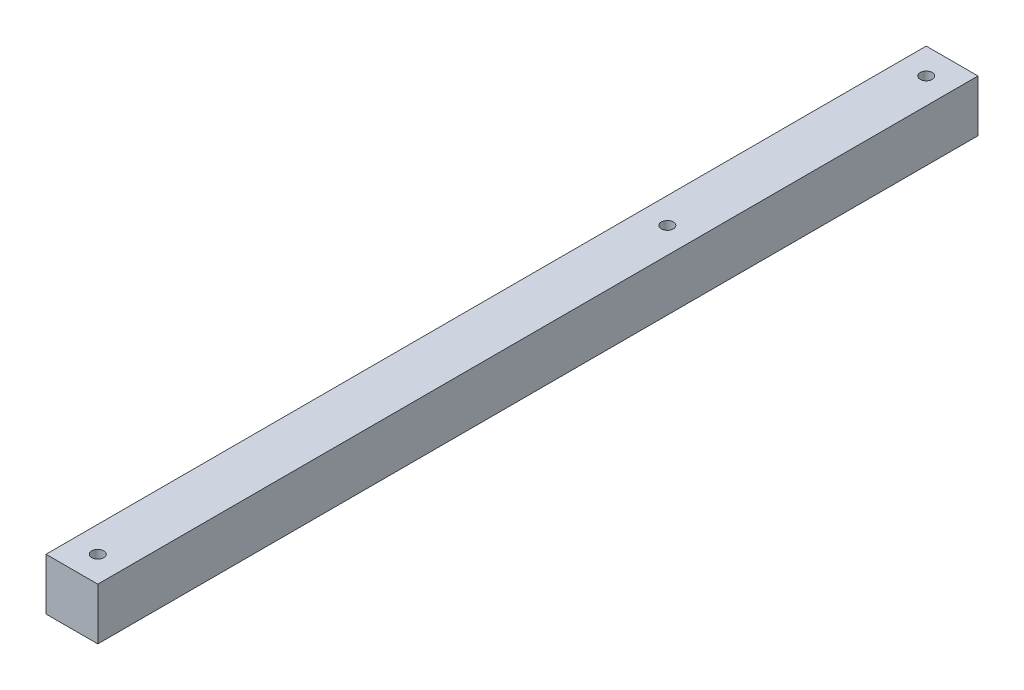
ISO-10303-21;
HEADER;
FILE_DESCRIPTION(('STEP AP214'),'2;1');
FILE_NAME('part.step','',(''),(''),'','','');
FILE_SCHEMA(('AUTOMOTIVE_DESIGN { 1 0 10303 214 1 1 1 1 }'));
ENDSEC;
DATA;
#1=APPLICATION_CONTEXT('core data for automotive mechanical design processes');
#2=APPLICATION_PROTOCOL_DEFINITION('international standard','automotive_design',2000,#1);
#3=PRODUCT_CONTEXT('',#1,'mechanical');
#4=PRODUCT('Part','Part','',(#3));
#5=PRODUCT_RELATED_PRODUCT_CATEGORY('part','',(#4));
#6=PRODUCT_DEFINITION_FORMATION('','',#4);
#7=PRODUCT_DEFINITION_CONTEXT('part definition',#1,'design');
#8=PRODUCT_DEFINITION('design','',#6,#7);
#9=PRODUCT_DEFINITION_SHAPE('','',#8);
#10=(LENGTH_UNIT() NAMED_UNIT(*) SI_UNIT(.MILLI.,.METRE.));
#11=(NAMED_UNIT(*) PLANE_ANGLE_UNIT() SI_UNIT($,.RADIAN.));
#12=(NAMED_UNIT(*) SI_UNIT($,.STERADIAN.) SOLID_ANGLE_UNIT());
#13=UNCERTAINTY_MEASURE_WITH_UNIT(LENGTH_MEASURE(1.E-05),#10,'distance_accuracy_value','');
#14=(GEOMETRIC_REPRESENTATION_CONTEXT(3) GLOBAL_UNCERTAINTY_ASSIGNED_CONTEXT((#13)) GLOBAL_UNIT_ASSIGNED_CONTEXT((#10,
#11,#12)) REPRESENTATION_CONTEXT('',''));
#15=CARTESIAN_POINT('',(0.,0.,0.));
#16=DIRECTION('',(0.,0.,1.));
#17=DIRECTION('',(1.,0.,0.));
#18=AXIS2_PLACEMENT_3D('',#15,#16,#17);
#19=CARTESIAN_POINT('',(-12.7,12.7,12.7));
#20=DIRECTION('',(1.,0.,0.));
#21=DIRECTION('',(0.,0.,-1.));
#22=AXIS2_PLACEMENT_3D('',#19,#20,#21);
#23=PLANE('',#22);
#24=DIRECTION('',(0.,0.,1.));
#25=VECTOR('',#24,1.);
#26=CARTESIAN_POINT('',(-12.7,0.,12.7));
#27=LINE('',#26,#25);
#28=CARTESIAN_POINT('',(-12.7,0.,-203.2));
#29=VERTEX_POINT('',#28);
#30=CARTESIAN_POINT('',(-12.7,0.,12.7));
#31=VERTEX_POINT('',#30);
#32=EDGE_CURVE('E96',#29,#31,#27,.T.);
#33=ORIENTED_EDGE('',*,*,#32,.T.);
#34=DIRECTION('',(0.,-1.,0.));
#35=VECTOR('',#34,1.);
#36=CARTESIAN_POINT('',(-12.7,12.7,12.7));
#37=LINE('',#36,#35);
#38=CARTESIAN_POINT('',(-12.7,12.7,12.7));
#39=VERTEX_POINT('',#38);
#40=EDGE_CURVE('E11',#39,#31,#37,.T.);
#41=ORIENTED_EDGE('',*,*,#40,.F.);
#42=DIRECTION('',(0.,0.,1.));
#43=VECTOR('',#42,1.);
#44=CARTESIAN_POINT('',(-12.7,12.7,12.7));
#45=LINE('',#44,#43);
#46=CARTESIAN_POINT('',(-12.7,12.7,-203.2));
#47=VERTEX_POINT('',#46);
#48=EDGE_CURVE('E84',#47,#39,#45,.T.);
#49=ORIENTED_EDGE('',*,*,#48,.F.);
#50=DIRECTION('',(0.,-1.,0.));
#51=VECTOR('',#50,1.);
#52=CARTESIAN_POINT('',(-12.7,12.7,-203.2));
#53=LINE('',#52,#51);
#54=EDGE_CURVE('E92',#47,#29,#53,.T.);
#55=ORIENTED_EDGE('',*,*,#54,.T.);
#56=EDGE_LOOP('',(#33,#41,#49,#55));
#57=FACE_BOUND('',#56,.T.);
#58=ADVANCED_FACE('F33',(#57),#23,.F.);
#59=CARTESIAN_POINT('',(-12.7,12.7,12.7));
#60=DIRECTION('',(0.,0.,-1.));
#61=DIRECTION('',(-1.,0.,0.));
#62=AXIS2_PLACEMENT_3D('',#59,#60,#61);
#63=PLANE('',#62);
#64=DIRECTION('',(1.,0.,0.));
#65=VECTOR('',#64,1.);
#66=CARTESIAN_POINT('',(-12.7,0.,12.7));
#67=LINE('',#66,#65);
#68=CARTESIAN_POINT('',(0.,0.,12.7));
#69=VERTEX_POINT('',#68);
#70=EDGE_CURVE('E88',#31,#69,#67,.T.);
#71=ORIENTED_EDGE('',*,*,#70,.T.);
#72=DIRECTION('',(0.,-1.,0.));
#73=VECTOR('',#72,1.);
#74=CARTESIAN_POINT('',(0.,12.7,12.7));
#75=LINE('',#74,#73);
#76=CARTESIAN_POINT('',(0.,12.7,12.7));
#77=VERTEX_POINT('',#76);
#78=EDGE_CURVE('E41',#77,#69,#75,.T.);
#79=ORIENTED_EDGE('',*,*,#78,.F.);
#80=DIRECTION('',(1.,0.,0.));
#81=VECTOR('',#80,1.);
#82=CARTESIAN_POINT('',(-12.7,12.7,12.7));
#83=LINE('',#82,#81);
#84=EDGE_CURVE('E79',#39,#77,#83,.T.);
#85=ORIENTED_EDGE('',*,*,#84,.F.);
#86=ORIENTED_EDGE('',*,*,#40,.T.);
#87=EDGE_LOOP('',(#71,#79,#85,#86));
#88=FACE_BOUND('',#87,.T.);
#89=ADVANCED_FACE('F87',(#88),#63,.F.);
#90=CARTESIAN_POINT('',(0.,12.7,12.7));
#91=DIRECTION('',(-1.,0.,0.));
#92=DIRECTION('',(0.,0.,1.));
#93=AXIS2_PLACEMENT_3D('',#90,#91,#92);
#94=PLANE('',#93);
#95=DIRECTION('',(0.,0.,-1.));
#96=VECTOR('',#95,1.);
#97=CARTESIAN_POINT('',(0.,0.,12.7));
#98=LINE('',#97,#96);
#99=CARTESIAN_POINT('',(0.,0.,-203.2));
#100=VERTEX_POINT('',#99);
#101=EDGE_CURVE('E66',#69,#100,#98,.T.);
#102=ORIENTED_EDGE('',*,*,#101,.T.);
#103=DIRECTION('',(0.,-1.,0.));
#104=VECTOR('',#103,1.);
#105=CARTESIAN_POINT('',(0.,12.7,-203.2));
#106=LINE('',#105,#104);
#107=CARTESIAN_POINT('',(0.,12.7,-203.2));
#108=VERTEX_POINT('',#107);
#109=EDGE_CURVE('E89',#108,#100,#106,.T.);
#110=ORIENTED_EDGE('',*,*,#109,.F.);
#111=DIRECTION('',(0.,0.,-1.));
#112=VECTOR('',#111,1.);
#113=CARTESIAN_POINT('',(0.,12.7,12.7));
#114=LINE('',#113,#112);
#115=EDGE_CURVE('E82',#77,#108,#114,.T.);
#116=ORIENTED_EDGE('',*,*,#115,.F.);
#117=ORIENTED_EDGE('',*,*,#78,.T.);
#118=EDGE_LOOP('',(#102,#110,#116,#117));
#119=FACE_BOUND('',#118,.T.);
#120=ADVANCED_FACE('F90',(#119),#94,.F.);
#121=CARTESIAN_POINT('',(-12.7,12.7,-203.2));
#122=DIRECTION('',(0.,0.,1.));
#123=DIRECTION('',(1.,0.,0.));
#124=AXIS2_PLACEMENT_3D('',#121,#122,#123);
#125=PLANE('',#124);
#126=DIRECTION('',(-1.,0.,0.));
#127=VECTOR('',#126,1.);
#128=CARTESIAN_POINT('',(-12.7,0.,-203.2));
#129=LINE('',#128,#127);
#130=EDGE_CURVE('E72',#100,#29,#129,.T.);
#131=ORIENTED_EDGE('',*,*,#130,.T.);
#132=ORIENTED_EDGE('',*,*,#54,.F.);
#133=DIRECTION('',(-1.,0.,0.));
#134=VECTOR('',#133,1.);
#135=CARTESIAN_POINT('',(-12.7,12.7,-203.2));
#136=LINE('',#135,#134);
#137=EDGE_CURVE('E49',#108,#47,#136,.T.);
#138=ORIENTED_EDGE('',*,*,#137,.F.);
#139=ORIENTED_EDGE('',*,*,#109,.T.);
#140=EDGE_LOOP('',(#131,#132,#138,#139));
#141=FACE_BOUND('',#140,.T.);
#142=ADVANCED_FACE('F104',(#141),#125,.F.);
#143=CARTESIAN_POINT('',(0.,12.7,0.));
#144=DIRECTION('',(0.,-1.,0.));
#145=DIRECTION('',(0.,0.,-1.));
#146=AXIS2_PLACEMENT_3D('',#143,#144,#145);
#147=PLANE('',#146);
#148=CARTESIAN_POINT('',(-6.35,12.7,-196.85));
#149=DIRECTION('',(0.,1.,0.));
#150=DIRECTION('',(0.,0.,1.));
#151=AXIS2_PLACEMENT_3D('',#148,#149,#150);
#152=CIRCLE('',#151,1.47319999999999);
#153=CARTESIAN_POINT('',(-6.35,12.7,-195.3768));
#154=VERTEX_POINT('',#153);
#155=EDGE_CURVE('E124',#154,#154,#152,.T.);
#156=ORIENTED_EDGE('',*,*,#155,.F.);
#157=EDGE_LOOP('',(#156));
#158=FACE_BOUND('',#157,.T.);
#159=CARTESIAN_POINT('',(-6.35,12.7,-133.35));
#160=DIRECTION('',(0.,1.,0.));
#161=DIRECTION('',(0.,0.,1.));
#162=AXIS2_PLACEMENT_3D('',#159,#160,#161);
#163=CIRCLE('',#162,1.47319999999999);
#164=CARTESIAN_POINT('',(-6.35,12.7,-131.8768));
#165=VERTEX_POINT('',#164);
#166=EDGE_CURVE('E118',#165,#165,#163,.T.);
#167=ORIENTED_EDGE('',*,*,#166,.F.);
#168=EDGE_LOOP('',(#167));
#169=FACE_BOUND('',#168,.T.);
#170=CARTESIAN_POINT('',(-6.35,12.7,6.35));
#171=DIRECTION('',(0.,1.,0.));
#172=DIRECTION('',(0.,0.,1.));
#173=AXIS2_PLACEMENT_3D('',#170,#171,#172);
#174=CIRCLE('',#173,1.47319999999999);
#175=CARTESIAN_POINT('',(-6.35,12.7,7.82319999999999));
#176=VERTEX_POINT('',#175);
#177=EDGE_CURVE('E112',#176,#176,#174,.T.);
#178=ORIENTED_EDGE('',*,*,#177,.F.);
#179=EDGE_LOOP('',(#178));
#180=FACE_BOUND('',#179,.T.);
#181=ORIENTED_EDGE('',*,*,#48,.T.);
#182=ORIENTED_EDGE('',*,*,#84,.T.);
#183=ORIENTED_EDGE('',*,*,#115,.T.);
#184=ORIENTED_EDGE('',*,*,#137,.T.);
#185=EDGE_LOOP('',(#181,#182,#183,#184));
#186=FACE_BOUND('',#185,.T.);
#187=ADVANCED_FACE('F80',(#158,#169,#180,#186),#147,.F.);
#188=CARTESIAN_POINT('',(0.,0.,0.));
#189=DIRECTION('',(0.,-1.,0.));
#190=DIRECTION('',(0.,0.,-1.));
#191=AXIS2_PLACEMENT_3D('',#188,#189,#190);
#192=PLANE('',#191);
#193=CARTESIAN_POINT('',(-6.35,0.,-196.85));
#194=DIRECTION('',(0.,1.,0.));
#195=DIRECTION('',(0.,0.,1.));
#196=AXIS2_PLACEMENT_3D('',#193,#194,#195);
#197=CIRCLE('',#196,1.4732);
#198=CARTESIAN_POINT('',(-6.35,0.,-195.3768));
#199=VERTEX_POINT('',#198);
#200=EDGE_CURVE('E121',#199,#199,#197,.T.);
#201=ORIENTED_EDGE('',*,*,#200,.T.);
#202=EDGE_LOOP('',(#201));
#203=FACE_BOUND('',#202,.T.);
#204=CARTESIAN_POINT('',(-6.35,0.,-133.35));
#205=DIRECTION('',(0.,1.,0.));
#206=DIRECTION('',(0.,0.,1.));
#207=AXIS2_PLACEMENT_3D('',#204,#205,#206);
#208=CIRCLE('',#207,1.4732);
#209=CARTESIAN_POINT('',(-6.35,0.,-131.8768));
#210=VERTEX_POINT('',#209);
#211=EDGE_CURVE('E115',#210,#210,#208,.T.);
#212=ORIENTED_EDGE('',*,*,#211,.T.);
#213=EDGE_LOOP('',(#212));
#214=FACE_BOUND('',#213,.T.);
#215=CARTESIAN_POINT('',(-6.35,0.,6.35));
#216=DIRECTION('',(0.,1.,0.));
#217=DIRECTION('',(0.,0.,1.));
#218=AXIS2_PLACEMENT_3D('',#215,#216,#217);
#219=CIRCLE('',#218,1.4732);
#220=CARTESIAN_POINT('',(-6.35,0.,7.8232));
#221=VERTEX_POINT('',#220);
#222=EDGE_CURVE('E99',#221,#221,#219,.T.);
#223=ORIENTED_EDGE('',*,*,#222,.T.);
#224=EDGE_LOOP('',(#223));
#225=FACE_BOUND('',#224,.T.);
#226=ORIENTED_EDGE('',*,*,#32,.F.);
#227=ORIENTED_EDGE('',*,*,#130,.F.);
#228=ORIENTED_EDGE('',*,*,#101,.F.);
#229=ORIENTED_EDGE('',*,*,#70,.F.);
#230=EDGE_LOOP('',(#226,#227,#228,#229));
#231=FACE_BOUND('',#230,.T.);
#232=ADVANCED_FACE('F107',(#203,#214,#225,#231),#192,.T.);
#233=CARTESIAN_POINT('',(-6.35,12.7,6.35));
#234=DIRECTION('',(0.,1.,0.));
#235=DIRECTION('',(0.,0.,1.));
#236=AXIS2_PLACEMENT_3D('',#233,#234,#235);
#237=CYLINDRICAL_SURFACE('',#236,1.47319999999999);
#238=ORIENTED_EDGE('',*,*,#222,.F.);
#239=EDGE_LOOP('',(#238));
#240=FACE_BOUND('',#239,.T.);
#241=ORIENTED_EDGE('',*,*,#177,.T.);
#242=EDGE_LOOP('',(#241));
#243=FACE_BOUND('',#242,.T.);
#244=ADVANCED_FACE('F137',(#240,#243),#237,.F.);
#245=CARTESIAN_POINT('',(-6.35,12.7,-133.35));
#246=DIRECTION('',(0.,1.,0.));
#247=DIRECTION('',(0.,0.,1.));
#248=AXIS2_PLACEMENT_3D('',#245,#246,#247);
#249=CYLINDRICAL_SURFACE('',#248,1.47319999999999);
#250=ORIENTED_EDGE('',*,*,#211,.F.);
#251=EDGE_LOOP('',(#250));
#252=FACE_BOUND('',#251,.T.);
#253=ORIENTED_EDGE('',*,*,#166,.T.);
#254=EDGE_LOOP('',(#253));
#255=FACE_BOUND('',#254,.T.);
#256=ADVANCED_FACE('F139',(#252,#255),#249,.F.);
#257=CARTESIAN_POINT('',(-6.35,12.7,-196.85));
#258=DIRECTION('',(0.,1.,0.));
#259=DIRECTION('',(0.,0.,1.));
#260=AXIS2_PLACEMENT_3D('',#257,#258,#259);
#261=CYLINDRICAL_SURFACE('',#260,1.47319999999999);
#262=ORIENTED_EDGE('',*,*,#200,.F.);
#263=EDGE_LOOP('',(#262));
#264=FACE_BOUND('',#263,.T.);
#265=ORIENTED_EDGE('',*,*,#155,.T.);
#266=EDGE_LOOP('',(#265));
#267=FACE_BOUND('',#266,.T.);
#268=ADVANCED_FACE('F128',(#264,#267),#261,.F.);
#269=CLOSED_SHELL('',(#58,#89,#120,#142,#187,#232,#244,#256,#268));
#270=MANIFOLD_SOLID_BREP('B2',#269);
#271=ADVANCED_BREP_SHAPE_REPRESENTATION('',(#18,#270),#14);
#272=SHAPE_DEFINITION_REPRESENTATION(#9,#271);
ENDSEC;
END-ISO-10303-21;
